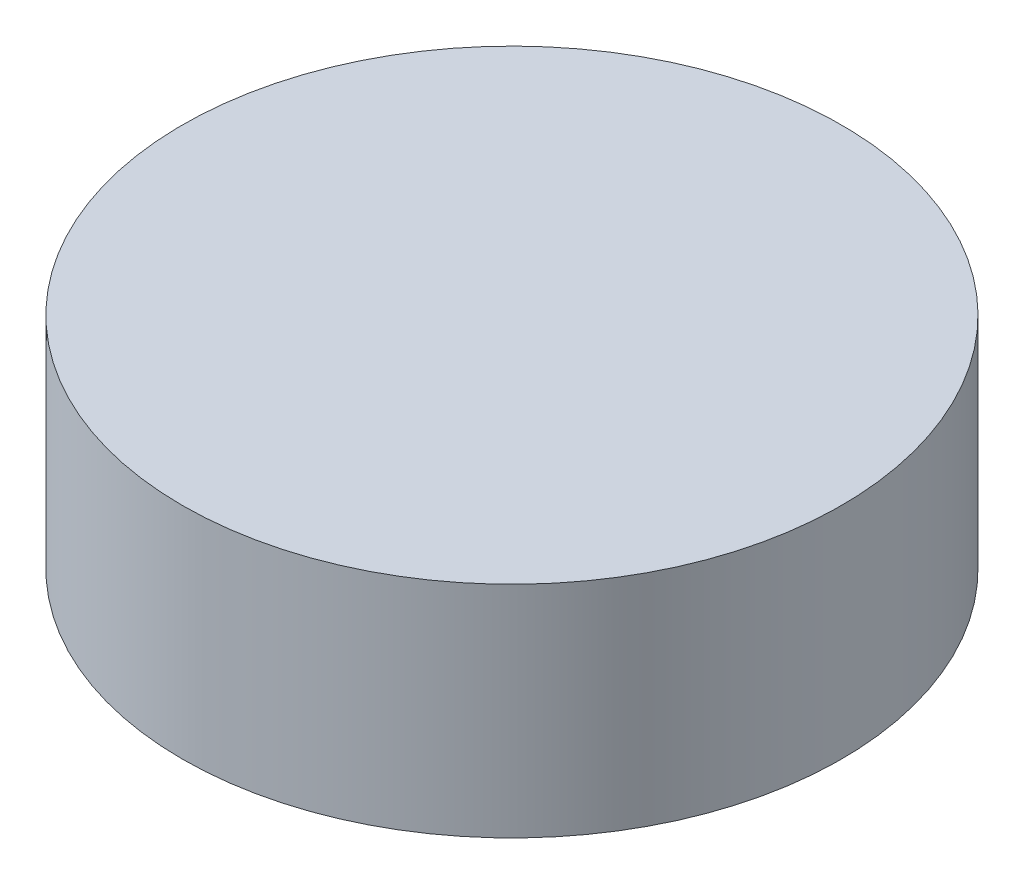
ISO-10303-21;
HEADER;
FILE_DESCRIPTION(('STEP AP214'),'2;1');
FILE_NAME('part.step','',(''),(''),'','','');
FILE_SCHEMA(('AUTOMOTIVE_DESIGN { 1 0 10303 214 1 1 1 1 }'));
ENDSEC;
DATA;
#1=APPLICATION_CONTEXT('core data for automotive mechanical design processes');
#2=APPLICATION_PROTOCOL_DEFINITION('international standard','automotive_design',2000,#1);
#3=PRODUCT_CONTEXT('',#1,'mechanical');
#4=PRODUCT('Part','Part','',(#3));
#5=PRODUCT_RELATED_PRODUCT_CATEGORY('part','',(#4));
#6=PRODUCT_DEFINITION_FORMATION('','',#4);
#7=PRODUCT_DEFINITION_CONTEXT('part definition',#1,'design');
#8=PRODUCT_DEFINITION('design','',#6,#7);
#9=PRODUCT_DEFINITION_SHAPE('','',#8);
#10=(LENGTH_UNIT() NAMED_UNIT(*) SI_UNIT(.MILLI.,.METRE.));
#11=(NAMED_UNIT(*) PLANE_ANGLE_UNIT() SI_UNIT($,.RADIAN.));
#12=(NAMED_UNIT(*) SI_UNIT($,.STERADIAN.) SOLID_ANGLE_UNIT());
#13=UNCERTAINTY_MEASURE_WITH_UNIT(LENGTH_MEASURE(1.E-05),#10,'distance_accuracy_value','');
#14=(GEOMETRIC_REPRESENTATION_CONTEXT(3) GLOBAL_UNCERTAINTY_ASSIGNED_CONTEXT((#13)) GLOBAL_UNIT_ASSIGNED_CONTEXT((#10,
#11,#12)) REPRESENTATION_CONTEXT('',''));
#15=CARTESIAN_POINT('',(0.,0.,0.));
#16=DIRECTION('',(0.,0.,1.));
#17=DIRECTION('',(1.,0.,0.));
#18=AXIS2_PLACEMENT_3D('',#15,#16,#17);
#19=CARTESIAN_POINT('',(0.,10.,0.));
#20=DIRECTION('',(0.,-1.,0.));
#21=DIRECTION('',(0.,0.,-1.));
#22=AXIS2_PLACEMENT_3D('',#19,#20,#21);
#23=CYLINDRICAL_SURFACE('',#22,15.);
#24=CARTESIAN_POINT('',(0.,10.,0.));
#25=DIRECTION('',(0.,1.,0.));
#26=DIRECTION('',(0.,0.,1.));
#27=AXIS2_PLACEMENT_3D('',#24,#25,#26);
#28=CIRCLE('',#27,15.);
#29=CARTESIAN_POINT('',(0.,10.,15.));
#30=VERTEX_POINT('',#29);
#31=EDGE_CURVE('E10',#30,#30,#28,.T.);
#32=ORIENTED_EDGE('',*,*,#31,.F.);
#33=EDGE_LOOP('',(#32));
#34=FACE_BOUND('',#33,.T.);
#35=CARTESIAN_POINT('',(0.,0.,0.));
#36=DIRECTION('',(0.,1.,0.));
#37=DIRECTION('',(0.,0.,1.));
#38=AXIS2_PLACEMENT_3D('',#35,#36,#37);
#39=CIRCLE('',#38,15.);
#40=CARTESIAN_POINT('',(0.,0.,15.));
#41=VERTEX_POINT('',#40);
#42=EDGE_CURVE('E40',#41,#41,#39,.T.);
#43=ORIENTED_EDGE('',*,*,#42,.T.);
#44=EDGE_LOOP('',(#43));
#45=FACE_BOUND('',#44,.T.);
#46=ADVANCED_FACE('F37',(#34,#45),#23,.T.);
#47=CARTESIAN_POINT('',(0.,10.,0.));
#48=DIRECTION('',(0.,1.,0.));
#49=DIRECTION('',(0.,0.,1.));
#50=AXIS2_PLACEMENT_3D('',#47,#48,#49);
#51=PLANE('',#50);
#52=ORIENTED_EDGE('',*,*,#31,.T.);
#53=EDGE_LOOP('',(#52));
#54=FACE_BOUND('',#53,.T.);
#55=ADVANCED_FACE('F52',(#54),#51,.T.);
#56=CARTESIAN_POINT('',(0.,0.,0.));
#57=DIRECTION('',(0.,1.,0.));
#58=DIRECTION('',(0.,0.,1.));
#59=AXIS2_PLACEMENT_3D('',#56,#57,#58);
#60=PLANE('',#59);
#61=ORIENTED_EDGE('',*,*,#42,.F.);
#62=EDGE_LOOP('',(#61));
#63=FACE_BOUND('',#62,.T.);
#64=ADVANCED_FACE('F50',(#63),#60,.F.);
#65=CLOSED_SHELL('',(#46,#55,#64));
#66=MANIFOLD_SOLID_BREP('B2',#65);
#67=ADVANCED_BREP_SHAPE_REPRESENTATION('',(#18,#66),#14);
#68=SHAPE_DEFINITION_REPRESENTATION(#9,#67);
ENDSEC;
END-ISO-10303-21;
